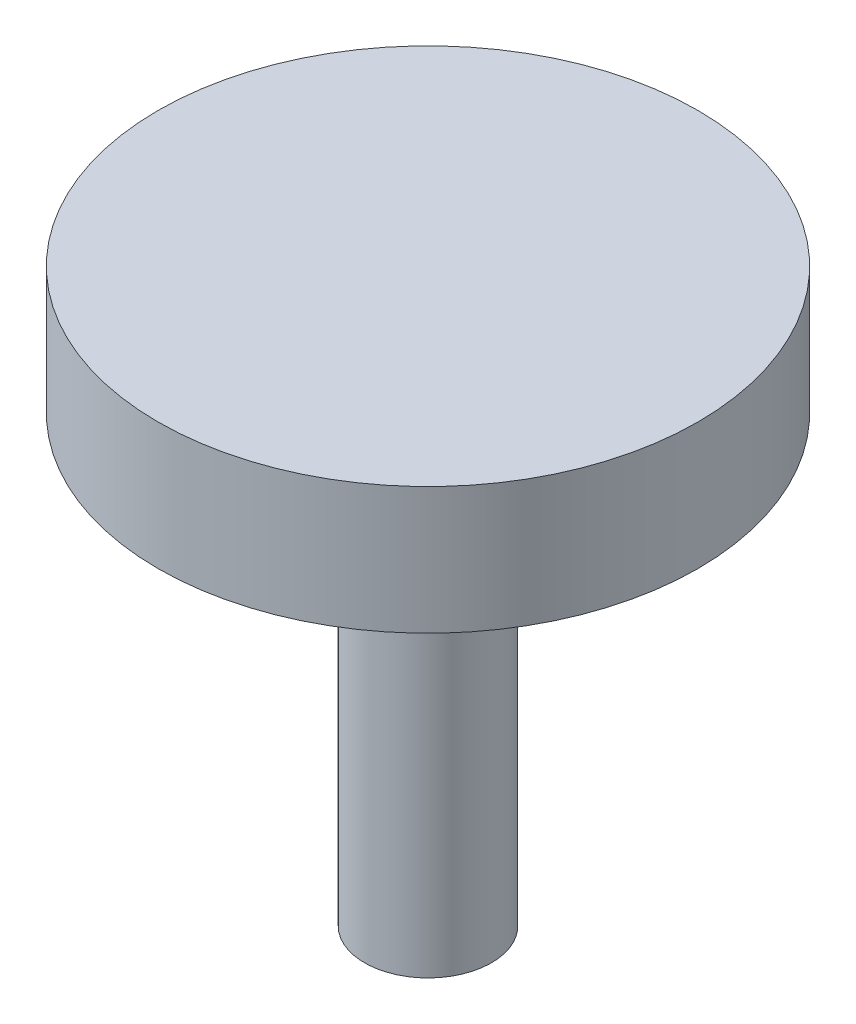
ISO-10303-21;
HEADER;
FILE_DESCRIPTION(('STEP AP214'),'2;1');
FILE_NAME('part.step','',(''),(''),'','','');
FILE_SCHEMA(('AUTOMOTIVE_DESIGN { 1 0 10303 214 1 1 1 1 }'));
ENDSEC;
DATA;
#1=APPLICATION_CONTEXT('core data for automotive mechanical design processes');
#2=APPLICATION_PROTOCOL_DEFINITION('international standard','automotive_design',2000,#1);
#3=PRODUCT_CONTEXT('',#1,'mechanical');
#4=PRODUCT('Part','Part','',(#3));
#5=PRODUCT_RELATED_PRODUCT_CATEGORY('part','',(#4));
#6=PRODUCT_DEFINITION_FORMATION('','',#4);
#7=PRODUCT_DEFINITION_CONTEXT('part definition',#1,'design');
#8=PRODUCT_DEFINITION('design','',#6,#7);
#9=PRODUCT_DEFINITION_SHAPE('','',#8);
#10=(LENGTH_UNIT() NAMED_UNIT(*) SI_UNIT(.MILLI.,.METRE.));
#11=(NAMED_UNIT(*) PLANE_ANGLE_UNIT() SI_UNIT($,.RADIAN.));
#12=(NAMED_UNIT(*) SI_UNIT($,.STERADIAN.) SOLID_ANGLE_UNIT());
#13=UNCERTAINTY_MEASURE_WITH_UNIT(LENGTH_MEASURE(1.E-05),#10,'distance_accuracy_value','');
#14=(GEOMETRIC_REPRESENTATION_CONTEXT(3) GLOBAL_UNCERTAINTY_ASSIGNED_CONTEXT((#13)) GLOBAL_UNIT_ASSIGNED_CONTEXT((#10,
#11,#12)) REPRESENTATION_CONTEXT('',''));
#15=CARTESIAN_POINT('',(0.,0.,0.));
#16=DIRECTION('',(0.,0.,1.));
#17=DIRECTION('',(1.,0.,0.));
#18=AXIS2_PLACEMENT_3D('',#15,#16,#17);
#19=CARTESIAN_POINT('',(0.,20.,0.));
#20=DIRECTION('',(0.,-1.,0.));
#21=DIRECTION('',(0.,0.,-1.));
#22=AXIS2_PLACEMENT_3D('',#19,#20,#21);
#23=CYLINDRICAL_SURFACE('',#22,42.5);
#24=CARTESIAN_POINT('',(0.,20.,0.));
#25=DIRECTION('',(0.,1.,0.));
#26=DIRECTION('',(0.,0.,1.));
#27=AXIS2_PLACEMENT_3D('',#24,#25,#26);
#28=CIRCLE('',#27,42.5);
#29=CARTESIAN_POINT('',(0.,20.,42.5));
#30=VERTEX_POINT('',#29);
#31=EDGE_CURVE('E38',#30,#30,#28,.T.);
#32=ORIENTED_EDGE('',*,*,#31,.F.);
#33=EDGE_LOOP('',(#32));
#34=FACE_BOUND('',#33,.T.);
#35=CARTESIAN_POINT('',(0.,0.,0.));
#36=DIRECTION('',(0.,1.,0.));
#37=DIRECTION('',(0.,0.,1.));
#38=AXIS2_PLACEMENT_3D('',#35,#36,#37);
#39=CIRCLE('',#38,42.5);
#40=CARTESIAN_POINT('',(0.,0.,42.5));
#41=VERTEX_POINT('',#40);
#42=EDGE_CURVE('E34',#41,#41,#39,.T.);
#43=ORIENTED_EDGE('',*,*,#42,.T.);
#44=EDGE_LOOP('',(#43));
#45=FACE_BOUND('',#44,.T.);
#46=ADVANCED_FACE('F31',(#34,#45),#23,.T.);
#47=CARTESIAN_POINT('',(0.,20.,0.));
#48=DIRECTION('',(0.,1.,0.));
#49=DIRECTION('',(0.,0.,1.));
#50=AXIS2_PLACEMENT_3D('',#47,#48,#49);
#51=PLANE('',#50);
#52=ORIENTED_EDGE('',*,*,#31,.T.);
#53=EDGE_LOOP('',(#52));
#54=FACE_BOUND('',#53,.T.);
#55=ADVANCED_FACE('F55',(#54),#51,.T.);
#56=CARTESIAN_POINT('',(0.,0.,0.));
#57=DIRECTION('',(0.,1.,0.));
#58=DIRECTION('',(0.,0.,1.));
#59=AXIS2_PLACEMENT_3D('',#56,#57,#58);
#60=PLANE('',#59);
#61=CARTESIAN_POINT('',(0.,0.,0.));
#62=DIRECTION('',(0.,-1.,0.));
#63=DIRECTION('',(0.,0.,-1.));
#64=AXIS2_PLACEMENT_3D('',#61,#62,#63);
#65=CIRCLE('',#64,10.);
#66=CARTESIAN_POINT('',(0.,0.,-10.));
#67=VERTEX_POINT('',#66);
#68=EDGE_CURVE('E10',#67,#67,#65,.T.);
#69=ORIENTED_EDGE('',*,*,#68,.F.);
#70=EDGE_LOOP('',(#69));
#71=FACE_BOUND('',#70,.T.);
#72=ORIENTED_EDGE('',*,*,#42,.F.);
#73=EDGE_LOOP('',(#72));
#74=FACE_BOUND('',#73,.T.);
#75=ADVANCED_FACE('F52',(#71,#74),#60,.F.);
#76=CARTESIAN_POINT('',(0.,-70.,0.));
#77=DIRECTION('',(0.,1.,0.));
#78=DIRECTION('',(0.,0.,1.));
#79=AXIS2_PLACEMENT_3D('',#76,#77,#78);
#80=CYLINDRICAL_SURFACE('',#79,10.);
#81=CARTESIAN_POINT('',(0.,-70.,0.));
#82=DIRECTION('',(0.,-1.,0.));
#83=DIRECTION('',(0.,0.,-1.));
#84=AXIS2_PLACEMENT_3D('',#81,#82,#83);
#85=CIRCLE('',#84,10.);
#86=CARTESIAN_POINT('',(0.,-70.,-10.));
#87=VERTEX_POINT('',#86);
#88=EDGE_CURVE('E44',#87,#87,#85,.T.);
#89=ORIENTED_EDGE('',*,*,#88,.F.);
#90=EDGE_LOOP('',(#89));
#91=FACE_BOUND('',#90,.T.);
#92=ORIENTED_EDGE('',*,*,#68,.T.);
#93=EDGE_LOOP('',(#92));
#94=FACE_BOUND('',#93,.T.);
#95=ADVANCED_FACE('F54',(#91,#94),#80,.T.);
#96=CARTESIAN_POINT('',(0.,-70.,0.));
#97=DIRECTION('',(0.,-1.,0.));
#98=DIRECTION('',(0.,0.,-1.));
#99=AXIS2_PLACEMENT_3D('',#96,#97,#98);
#100=PLANE('',#99);
#101=ORIENTED_EDGE('',*,*,#88,.T.);
#102=EDGE_LOOP('',(#101));
#103=FACE_BOUND('',#102,.T.);
#104=ADVANCED_FACE('F61',(#103),#100,.T.);
#105=CLOSED_SHELL('',(#46,#55,#75,#95,#104));
#106=MANIFOLD_SOLID_BREP('B2',#105);
#107=ADVANCED_BREP_SHAPE_REPRESENTATION('',(#18,#106),#14);
#108=SHAPE_DEFINITION_REPRESENTATION(#9,#107);
ENDSEC;
END-ISO-10303-21;
